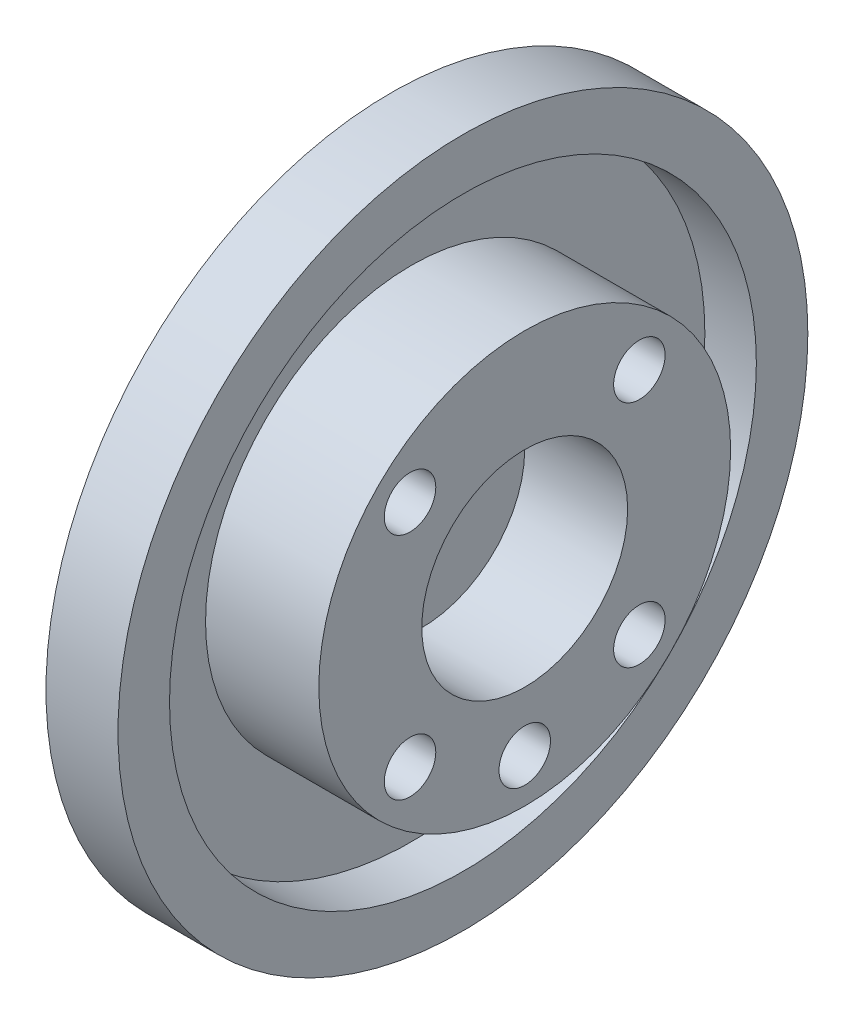
ISO-10303-21;
HEADER;
FILE_DESCRIPTION(('STEP AP214'),'2;1');
FILE_NAME('part.step','',(''),(''),'','','');
FILE_SCHEMA(('AUTOMOTIVE_DESIGN { 1 0 10303 214 1 1 1 1 }'));
ENDSEC;
DATA;
#1=APPLICATION_CONTEXT('core data for automotive mechanical design processes');
#2=APPLICATION_PROTOCOL_DEFINITION('international standard','automotive_design',2000,#1);
#3=PRODUCT_CONTEXT('',#1,'mechanical');
#4=PRODUCT('Part','Part','',(#3));
#5=PRODUCT_RELATED_PRODUCT_CATEGORY('part','',(#4));
#6=PRODUCT_DEFINITION_FORMATION('','',#4);
#7=PRODUCT_DEFINITION_CONTEXT('part definition',#1,'design');
#8=PRODUCT_DEFINITION('design','',#6,#7);
#9=PRODUCT_DEFINITION_SHAPE('','',#8);
#10=(LENGTH_UNIT() NAMED_UNIT(*) SI_UNIT(.MILLI.,.METRE.));
#11=(NAMED_UNIT(*) PLANE_ANGLE_UNIT() SI_UNIT($,.RADIAN.));
#12=(NAMED_UNIT(*) SI_UNIT($,.STERADIAN.) SOLID_ANGLE_UNIT());
#13=UNCERTAINTY_MEASURE_WITH_UNIT(LENGTH_MEASURE(1.E-05),#10,'distance_accuracy_value','');
#14=(GEOMETRIC_REPRESENTATION_CONTEXT(3) GLOBAL_UNCERTAINTY_ASSIGNED_CONTEXT((#13)) GLOBAL_UNIT_ASSIGNED_CONTEXT((#10,
#11,#12)) REPRESENTATION_CONTEXT('',''));
#15=CARTESIAN_POINT('',(0.,0.,0.));
#16=DIRECTION('',(0.,0.,1.));
#17=DIRECTION('',(1.,0.,0.));
#18=AXIS2_PLACEMENT_3D('',#15,#16,#17);
#19=CARTESIAN_POINT('',(2.,0.,0.));
#20=DIRECTION('',(1.,0.,0.));
#21=DIRECTION('',(0.,0.,-1.));
#22=AXIS2_PLACEMENT_3D('',#19,#20,#21);
#23=PLANE('',#22);
#24=CARTESIAN_POINT('',(2.,0.,0.));
#25=DIRECTION('',(1.,0.,0.));
#26=DIRECTION('',(0.,0.,-1.));
#27=AXIS2_PLACEMENT_3D('',#24,#25,#26);
#28=CIRCLE('',#27,28.5);
#29=CARTESIAN_POINT('',(2.,0.,-28.5));
#30=VERTEX_POINT('',#29);
#31=EDGE_CURVE('E140',#30,#30,#28,.T.);
#32=ORIENTED_EDGE('',*,*,#31,.T.);
#33=EDGE_LOOP('',(#32));
#34=FACE_BOUND('',#33,.T.);
#35=CARTESIAN_POINT('',(2.,0.,0.));
#36=DIRECTION('',(1.,0.,0.));
#37=DIRECTION('',(0.,0.,-1.));
#38=AXIS2_PLACEMENT_3D('',#35,#36,#37);
#39=CIRCLE('',#38,20.);
#40=CARTESIAN_POINT('',(2.,0.,-20.));
#41=VERTEX_POINT('',#40);
#42=EDGE_CURVE('E125',#41,#41,#39,.T.);
#43=ORIENTED_EDGE('',*,*,#42,.F.);
#44=EDGE_LOOP('',(#43));
#45=FACE_BOUND('',#44,.T.);
#46=ADVANCED_FACE('F36',(#34,#45),#23,.T.);
#47=CARTESIAN_POINT('',(7.,0.,0.));
#48=DIRECTION('',(-1.,0.,0.));
#49=DIRECTION('',(0.,0.,1.));
#50=AXIS2_PLACEMENT_3D('',#47,#48,#49);
#51=CYLINDRICAL_SURFACE('',#50,33.5);
#52=CARTESIAN_POINT('',(7.,0.,0.));
#53=DIRECTION('',(1.,0.,0.));
#54=DIRECTION('',(0.,0.,-1.));
#55=AXIS2_PLACEMENT_3D('',#52,#53,#54);
#56=CIRCLE('',#55,33.5);
#57=CARTESIAN_POINT('',(7.,0.,-33.5));
#58=VERTEX_POINT('',#57);
#59=EDGE_CURVE('E11',#58,#58,#56,.T.);
#60=ORIENTED_EDGE('',*,*,#59,.F.);
#61=EDGE_LOOP('',(#60));
#62=FACE_BOUND('',#61,.T.);
#63=CARTESIAN_POINT('',(0.,0.,0.));
#64=DIRECTION('',(1.,0.,0.));
#65=DIRECTION('',(0.,0.,-1.));
#66=AXIS2_PLACEMENT_3D('',#63,#64,#65);
#67=CIRCLE('',#66,33.5);
#68=CARTESIAN_POINT('',(0.,0.,-33.5));
#69=VERTEX_POINT('',#68);
#70=EDGE_CURVE('E44',#69,#69,#67,.T.);
#71=ORIENTED_EDGE('',*,*,#70,.T.);
#72=EDGE_LOOP('',(#71));
#73=FACE_BOUND('',#72,.T.);
#74=ADVANCED_FACE('F38',(#62,#73),#51,.T.);
#75=CARTESIAN_POINT('',(7.,0.,0.));
#76=DIRECTION('',(1.,0.,0.));
#77=DIRECTION('',(0.,0.,-1.));
#78=AXIS2_PLACEMENT_3D('',#75,#76,#77);
#79=PLANE('',#78);
#80=CARTESIAN_POINT('',(7.,0.,0.));
#81=DIRECTION('',(1.,0.,0.));
#82=DIRECTION('',(0.,0.,-1.));
#83=AXIS2_PLACEMENT_3D('',#80,#81,#82);
#84=CIRCLE('',#83,28.5);
#85=CARTESIAN_POINT('',(7.,0.,-28.5));
#86=VERTEX_POINT('',#85);
#87=EDGE_CURVE('E137',#86,#86,#84,.T.);
#88=ORIENTED_EDGE('',*,*,#87,.F.);
#89=EDGE_LOOP('',(#88));
#90=FACE_BOUND('',#89,.T.);
#91=ORIENTED_EDGE('',*,*,#59,.T.);
#92=EDGE_LOOP('',(#91));
#93=FACE_BOUND('',#92,.T.);
#94=ADVANCED_FACE('F149',(#90,#93),#79,.T.);
#95=CARTESIAN_POINT('',(0.,0.,0.));
#96=DIRECTION('',(1.,0.,0.));
#97=DIRECTION('',(0.,0.,-1.));
#98=AXIS2_PLACEMENT_3D('',#95,#96,#97);
#99=PLANE('',#98);
#100=CARTESIAN_POINT('',(0.,0.,0.));
#101=DIRECTION('',(1.,0.,0.));
#102=DIRECTION('',(0.,0.,-1.));
#103=AXIS2_PLACEMENT_3D('',#100,#101,#102);
#104=CIRCLE('',#103,2.5);
#105=CARTESIAN_POINT('',(0.,0.,-2.5));
#106=VERTEX_POINT('',#105);
#107=EDGE_CURVE('E134',#106,#106,#104,.T.);
#108=ORIENTED_EDGE('',*,*,#107,.T.);
#109=EDGE_LOOP('',(#108));
#110=FACE_BOUND('',#109,.T.);
#111=ORIENTED_EDGE('',*,*,#70,.F.);
#112=EDGE_LOOP('',(#111));
#113=FACE_BOUND('',#112,.T.);
#114=ADVANCED_FACE('F146',(#110,#113),#99,.F.);
#115=CARTESIAN_POINT('',(2.,0.,0.));
#116=DIRECTION('',(1.,0.,0.));
#117=DIRECTION('',(0.,0.,-1.));
#118=AXIS2_PLACEMENT_3D('',#115,#116,#117);
#119=CYLINDRICAL_SURFACE('',#118,28.5);
#120=ORIENTED_EDGE('',*,*,#31,.F.);
#121=EDGE_LOOP('',(#120));
#122=FACE_BOUND('',#121,.T.);
#123=ORIENTED_EDGE('',*,*,#87,.T.);
#124=EDGE_LOOP('',(#123));
#125=FACE_BOUND('',#124,.T.);
#126=ADVANCED_FACE('F148',(#122,#125),#119,.F.);
#127=CARTESIAN_POINT('',(-3.,0.,0.));
#128=DIRECTION('',(1.,0.,0.));
#129=DIRECTION('',(0.,0.,-1.));
#130=AXIS2_PLACEMENT_3D('',#127,#128,#129);
#131=CYLINDRICAL_SURFACE('',#130,2.5);
#132=CARTESIAN_POINT('',(2.,0.,0.));
#133=DIRECTION('',(1.,0.,0.));
#134=DIRECTION('',(0.,0.,-1.));
#135=AXIS2_PLACEMENT_3D('',#132,#133,#134);
#136=CIRCLE('',#135,2.5);
#137=CARTESIAN_POINT('',(2.,0.,-2.5));
#138=VERTEX_POINT('',#137);
#139=EDGE_CURVE('E131',#138,#138,#136,.F.);
#140=ORIENTED_EDGE('',*,*,#139,.F.);
#141=EDGE_LOOP('',(#140));
#142=FACE_BOUND('',#141,.T.);
#143=ORIENTED_EDGE('',*,*,#107,.F.);
#144=EDGE_LOOP('',(#143));
#145=FACE_BOUND('',#144,.T.);
#146=ADVANCED_FACE('F156',(#142,#145),#131,.F.);
#147=CARTESIAN_POINT('',(2.,0.,0.));
#148=DIRECTION('',(1.,0.,0.));
#149=DIRECTION('',(0.,0.,-1.));
#150=AXIS2_PLACEMENT_3D('',#147,#148,#149);
#151=PLANE('',#150);
#152=ORIENTED_EDGE('',*,*,#139,.T.);
#153=EDGE_LOOP('',(#152));
#154=FACE_BOUND('',#153,.T.);
#155=ADVANCED_FACE('F171',(#154),#151,.F.);
#156=CARTESIAN_POINT('',(13.,0.,0.));
#157=DIRECTION('',(-1.,0.,0.));
#158=DIRECTION('',(0.,0.,1.));
#159=AXIS2_PLACEMENT_3D('',#156,#157,#158);
#160=CYLINDRICAL_SURFACE('',#159,20.);
#161=CARTESIAN_POINT('',(13.,0.,0.));
#162=DIRECTION('',(1.,0.,0.));
#163=DIRECTION('',(0.,0.,-1.));
#164=AXIS2_PLACEMENT_3D('',#161,#162,#163);
#165=CIRCLE('',#164,20.);
#166=CARTESIAN_POINT('',(13.,0.,-20.));
#167=VERTEX_POINT('',#166);
#168=EDGE_CURVE('E128',#167,#167,#165,.T.);
#169=ORIENTED_EDGE('',*,*,#168,.F.);
#170=EDGE_LOOP('',(#169));
#171=FACE_BOUND('',#170,.T.);
#172=ORIENTED_EDGE('',*,*,#42,.T.);
#173=EDGE_LOOP('',(#172));
#174=FACE_BOUND('',#173,.T.);
#175=ADVANCED_FACE('F173',(#171,#174),#160,.T.);
#176=CARTESIAN_POINT('',(13.,0.,0.));
#177=DIRECTION('',(1.,0.,0.));
#178=DIRECTION('',(0.,0.,-1.));
#179=AXIS2_PLACEMENT_3D('',#176,#177,#178);
#180=PLANE('',#179);
#181=CARTESIAN_POINT('',(13.,-15.7403974326229,0.));
#182=DIRECTION('',(1.,0.,0.));
#183=DIRECTION('',(0.,0.,-1.));
#184=AXIS2_PLACEMENT_3D('',#181,#182,#183);
#185=CIRCLE('',#184,2.5);
#186=CARTESIAN_POINT('',(13.,-15.7403974326229,-2.5));
#187=VERTEX_POINT('',#186);
#188=EDGE_CURVE('E74',#187,#187,#185,.T.);
#189=ORIENTED_EDGE('',*,*,#188,.F.);
#190=EDGE_LOOP('',(#189));
#191=FACE_BOUND('',#190,.T.);
#192=CARTESIAN_POINT('',(13.,11.1369318036882,11.1369318036881));
#193=DIRECTION('',(1.,0.,0.));
#194=DIRECTION('',(0.,0.,-1.));
#195=AXIS2_PLACEMENT_3D('',#192,#193,#194);
#196=CIRCLE('',#195,2.5);
#197=CARTESIAN_POINT('',(13.,11.1369318036882,8.63693180368807));
#198=VERTEX_POINT('',#197);
#199=EDGE_CURVE('E80',#198,#198,#196,.T.);
#200=ORIENTED_EDGE('',*,*,#199,.F.);
#201=EDGE_LOOP('',(#200));
#202=FACE_BOUND('',#201,.T.);
#203=CARTESIAN_POINT('',(13.,-11.1369318036882,-11.1369318036881));
#204=DIRECTION('',(1.,0.,0.));
#205=DIRECTION('',(0.,0.,-1.));
#206=AXIS2_PLACEMENT_3D('',#203,#204,#205);
#207=CIRCLE('',#206,2.5);
#208=CARTESIAN_POINT('',(13.,-11.1369318036882,-13.6369318036881));
#209=VERTEX_POINT('',#208);
#210=EDGE_CURVE('E92',#209,#209,#207,.T.);
#211=ORIENTED_EDGE('',*,*,#210,.F.);
#212=EDGE_LOOP('',(#211));
#213=FACE_BOUND('',#212,.T.);
#214=CARTESIAN_POINT('',(13.,-11.1369318036881,11.1369318036882));
#215=DIRECTION('',(1.,0.,0.));
#216=DIRECTION('',(0.,0.,-1.));
#217=AXIS2_PLACEMENT_3D('',#214,#215,#216);
#218=CIRCLE('',#217,2.5);
#219=CARTESIAN_POINT('',(13.,-11.1369318036881,8.63693180368818));
#220=VERTEX_POINT('',#219);
#221=EDGE_CURVE('E104',#220,#220,#218,.T.);
#222=ORIENTED_EDGE('',*,*,#221,.F.);
#223=EDGE_LOOP('',(#222));
#224=FACE_BOUND('',#223,.T.);
#225=CARTESIAN_POINT('',(13.,11.1369318036881,-11.1369318036882));
#226=DIRECTION('',(1.,0.,0.));
#227=DIRECTION('',(0.,0.,-1.));
#228=AXIS2_PLACEMENT_3D('',#225,#226,#227);
#229=CIRCLE('',#228,2.5);
#230=CARTESIAN_POINT('',(13.,11.1369318036881,-13.6369318036882));
#231=VERTEX_POINT('',#230);
#232=EDGE_CURVE('E116',#231,#231,#229,.T.);
#233=ORIENTED_EDGE('',*,*,#232,.F.);
#234=EDGE_LOOP('',(#233));
#235=FACE_BOUND('',#234,.T.);
#236=CARTESIAN_POINT('',(13.,0.,0.));
#237=DIRECTION('',(1.,0.,0.));
#238=DIRECTION('',(0.,0.,-1.));
#239=AXIS2_PLACEMENT_3D('',#236,#237,#238);
#240=CIRCLE('',#239,10.);
#241=CARTESIAN_POINT('',(13.,0.,-10.));
#242=VERTEX_POINT('',#241);
#243=EDGE_CURVE('E119',#242,#242,#240,.T.);
#244=ORIENTED_EDGE('',*,*,#243,.F.);
#245=EDGE_LOOP('',(#244));
#246=FACE_BOUND('',#245,.T.);
#247=ORIENTED_EDGE('',*,*,#168,.T.);
#248=EDGE_LOOP('',(#247));
#249=FACE_BOUND('',#248,.T.);
#250=ADVANCED_FACE('F176',(#191,#202,#213,#224,#235,#246,#249),#180,.T.);
#251=CARTESIAN_POINT('',(3.,0.,0.));
#252=DIRECTION('',(1.,0.,0.));
#253=DIRECTION('',(0.,0.,-1.));
#254=AXIS2_PLACEMENT_3D('',#251,#252,#253);
#255=CYLINDRICAL_SURFACE('',#254,10.);
#256=CARTESIAN_POINT('',(3.,0.,0.));
#257=DIRECTION('',(1.,0.,0.));
#258=DIRECTION('',(0.,0.,-1.));
#259=AXIS2_PLACEMENT_3D('',#256,#257,#258);
#260=CIRCLE('',#259,10.);
#261=CARTESIAN_POINT('',(3.,0.,-10.));
#262=VERTEX_POINT('',#261);
#263=EDGE_CURVE('E122',#262,#262,#260,.T.);
#264=ORIENTED_EDGE('',*,*,#263,.F.);
#265=EDGE_LOOP('',(#264));
#266=FACE_BOUND('',#265,.T.);
#267=ORIENTED_EDGE('',*,*,#243,.T.);
#268=EDGE_LOOP('',(#267));
#269=FACE_BOUND('',#268,.T.);
#270=ADVANCED_FACE('F180',(#266,#269),#255,.F.);
#271=CARTESIAN_POINT('',(3.,0.,0.));
#272=DIRECTION('',(1.,0.,0.));
#273=DIRECTION('',(0.,0.,-1.));
#274=AXIS2_PLACEMENT_3D('',#271,#272,#273);
#275=PLANE('',#274);
#276=ORIENTED_EDGE('',*,*,#263,.T.);
#277=EDGE_LOOP('',(#276));
#278=FACE_BOUND('',#277,.T.);
#279=ADVANCED_FACE('F187',(#278),#275,.T.);
#280=CARTESIAN_POINT('',(13.,11.1369318036881,-11.1369318036882));
#281=DIRECTION('',(1.,0.,0.));
#282=DIRECTION('',(0.,0.,-1.));
#283=AXIS2_PLACEMENT_3D('',#280,#281,#282);
#284=CYLINDRICAL_SURFACE('',#283,2.5);
#285=CARTESIAN_POINT('',(3.,11.1369318036881,-11.1369318036882));
#286=DIRECTION('',(1.,0.,0.));
#287=DIRECTION('',(0.,0.,-1.));
#288=AXIS2_PLACEMENT_3D('',#285,#286,#287);
#289=CIRCLE('',#288,2.5);
#290=CARTESIAN_POINT('',(3.,11.1369318036881,-13.6369318036882));
#291=VERTEX_POINT('',#290);
#292=EDGE_CURVE('E113',#291,#291,#289,.T.);
#293=ORIENTED_EDGE('',*,*,#292,.F.);
#294=EDGE_LOOP('',(#293));
#295=FACE_BOUND('',#294,.T.);
#296=ORIENTED_EDGE('',*,*,#232,.T.);
#297=EDGE_LOOP('',(#296));
#298=FACE_BOUND('',#297,.T.);
#299=ADVANCED_FACE('F191',(#295,#298),#284,.F.);
#300=CARTESIAN_POINT('',(3.,13.2369318036881,-11.1369318036882));
#301=DIRECTION('',(-1.,0.,0.));
#302=DIRECTION('',(0.,0.,1.));
#303=AXIS2_PLACEMENT_3D('',#300,#301,#302);
#304=PLANE('',#303);
#305=CARTESIAN_POINT('',(3.,11.1369318036881,-11.1369318036882));
#306=DIRECTION('',(1.,0.,0.));
#307=DIRECTION('',(0.,0.,-1.));
#308=AXIS2_PLACEMENT_3D('',#305,#306,#307);
#309=CIRCLE('',#308,2.1);
#310=CARTESIAN_POINT('',(3.,11.1369318036881,-13.2369318036882));
#311=VERTEX_POINT('',#310);
#312=EDGE_CURVE('E110',#311,#311,#309,.T.);
#313=ORIENTED_EDGE('',*,*,#312,.F.);
#314=EDGE_LOOP('',(#313));
#315=FACE_BOUND('',#314,.T.);
#316=ORIENTED_EDGE('',*,*,#292,.T.);
#317=EDGE_LOOP('',(#316));
#318=FACE_BOUND('',#317,.T.);
#319=ADVANCED_FACE('F195',(#315,#318),#304,.F.);
#320=CARTESIAN_POINT('',(13.,11.1369318036881,-11.1369318036882));
#321=DIRECTION('',(1.,0.,0.));
#322=DIRECTION('',(0.,0.,-1.));
#323=AXIS2_PLACEMENT_3D('',#320,#321,#322);
#324=CYLINDRICAL_SURFACE('',#323,2.1);
#325=CARTESIAN_POINT('',(4.,11.1369318036881,-11.1369318036882));
#326=DIRECTION('',(1.,0.,0.));
#327=DIRECTION('',(0.,0.,-1.));
#328=AXIS2_PLACEMENT_3D('',#325,#326,#327);
#329=CIRCLE('',#328,2.1);
#330=CARTESIAN_POINT('',(4.,11.1369318036881,-13.2369318036882));
#331=VERTEX_POINT('',#330);
#332=EDGE_CURVE('E107',#331,#331,#329,.T.);
#333=ORIENTED_EDGE('',*,*,#332,.F.);
#334=EDGE_LOOP('',(#333));
#335=FACE_BOUND('',#334,.T.);
#336=ORIENTED_EDGE('',*,*,#312,.T.);
#337=EDGE_LOOP('',(#336));
#338=FACE_BOUND('',#337,.T.);
#339=ADVANCED_FACE('F199',(#335,#338),#324,.T.);
#340=CARTESIAN_POINT('',(4.,11.1369318036881,-11.1369318036882));
#341=DIRECTION('',(1.,0.,0.));
#342=DIRECTION('',(0.,0.,-1.));
#343=AXIS2_PLACEMENT_3D('',#340,#341,#342);
#344=CONICAL_SURFACE('',#343,2.1,1.02974425867665);
#345=CARTESIAN_POINT('',(2.73819270004212,11.1369318036881,-11.1369318036882));
#346=VERTEX_POINT('',#345);
#347=VERTEX_LOOP('',#346);
#348=FACE_BOUND('',#347,.T.);
#349=ORIENTED_EDGE('',*,*,#332,.T.);
#350=EDGE_LOOP('',(#349));
#351=FACE_BOUND('',#350,.T.);
#352=ADVANCED_FACE('F203',(#348,#351),#344,.F.);
#353=CARTESIAN_POINT('',(13.,-11.1369318036881,11.1369318036882));
#354=DIRECTION('',(1.,0.,0.));
#355=DIRECTION('',(0.,0.,-1.));
#356=AXIS2_PLACEMENT_3D('',#353,#354,#355);
#357=CYLINDRICAL_SURFACE('',#356,2.5);
#358=CARTESIAN_POINT('',(3.,-11.1369318036881,11.1369318036882));
#359=DIRECTION('',(1.,0.,0.));
#360=DIRECTION('',(0.,0.,-1.));
#361=AXIS2_PLACEMENT_3D('',#358,#359,#360);
#362=CIRCLE('',#361,2.5);
#363=CARTESIAN_POINT('',(3.,-11.1369318036881,8.63693180368818));
#364=VERTEX_POINT('',#363);
#365=EDGE_CURVE('E101',#364,#364,#362,.T.);
#366=ORIENTED_EDGE('',*,*,#365,.F.);
#367=EDGE_LOOP('',(#366));
#368=FACE_BOUND('',#367,.T.);
#369=ORIENTED_EDGE('',*,*,#221,.T.);
#370=EDGE_LOOP('',(#369));
#371=FACE_BOUND('',#370,.T.);
#372=ADVANCED_FACE('F207',(#368,#371),#357,.F.);
#373=CARTESIAN_POINT('',(3.,-9.03693180368807,11.1369318036882));
#374=DIRECTION('',(-1.,0.,0.));
#375=DIRECTION('',(0.,0.,1.));
#376=AXIS2_PLACEMENT_3D('',#373,#374,#375);
#377=PLANE('',#376);
#378=CARTESIAN_POINT('',(3.,-11.1369318036881,11.1369318036882));
#379=DIRECTION('',(1.,0.,0.));
#380=DIRECTION('',(0.,0.,-1.));
#381=AXIS2_PLACEMENT_3D('',#378,#379,#380);
#382=CIRCLE('',#381,2.1);
#383=CARTESIAN_POINT('',(3.,-11.1369318036881,9.03693180368818));
#384=VERTEX_POINT('',#383);
#385=EDGE_CURVE('E98',#384,#384,#382,.T.);
#386=ORIENTED_EDGE('',*,*,#385,.F.);
#387=EDGE_LOOP('',(#386));
#388=FACE_BOUND('',#387,.T.);
#389=ORIENTED_EDGE('',*,*,#365,.T.);
#390=EDGE_LOOP('',(#389));
#391=FACE_BOUND('',#390,.T.);
#392=ADVANCED_FACE('F210',(#388,#391),#377,.F.);
#393=CARTESIAN_POINT('',(13.,-11.1369318036881,11.1369318036882));
#394=DIRECTION('',(1.,0.,0.));
#395=DIRECTION('',(0.,0.,-1.));
#396=AXIS2_PLACEMENT_3D('',#393,#394,#395);
#397=CYLINDRICAL_SURFACE('',#396,2.1);
#398=CARTESIAN_POINT('',(4.,-11.1369318036881,11.1369318036882));
#399=DIRECTION('',(1.,0.,0.));
#400=DIRECTION('',(0.,0.,-1.));
#401=AXIS2_PLACEMENT_3D('',#398,#399,#400);
#402=CIRCLE('',#401,2.1);
#403=CARTESIAN_POINT('',(4.,-11.1369318036881,9.03693180368818));
#404=VERTEX_POINT('',#403);
#405=EDGE_CURVE('E95',#404,#404,#402,.T.);
#406=ORIENTED_EDGE('',*,*,#405,.F.);
#407=EDGE_LOOP('',(#406));
#408=FACE_BOUND('',#407,.T.);
#409=ORIENTED_EDGE('',*,*,#385,.T.);
#410=EDGE_LOOP('',(#409));
#411=FACE_BOUND('',#410,.T.);
#412=ADVANCED_FACE('F214',(#408,#411),#397,.T.);
#413=CARTESIAN_POINT('',(4.,-11.1369318036881,11.1369318036882));
#414=DIRECTION('',(1.,0.,0.));
#415=DIRECTION('',(0.,0.,-1.));
#416=AXIS2_PLACEMENT_3D('',#413,#414,#415);
#417=CONICAL_SURFACE('',#416,2.1,1.02974425867665);
#418=CARTESIAN_POINT('',(2.73819270004212,-11.1369318036881,11.1369318036882));
#419=VERTEX_POINT('',#418);
#420=VERTEX_LOOP('',#419);
#421=FACE_BOUND('',#420,.T.);
#422=ORIENTED_EDGE('',*,*,#405,.T.);
#423=EDGE_LOOP('',(#422));
#424=FACE_BOUND('',#423,.T.);
#425=ADVANCED_FACE('F218',(#421,#424),#417,.F.);
#426=CARTESIAN_POINT('',(13.,-11.1369318036882,-11.1369318036881));
#427=DIRECTION('',(1.,0.,0.));
#428=DIRECTION('',(0.,0.,-1.));
#429=AXIS2_PLACEMENT_3D('',#426,#427,#428);
#430=CYLINDRICAL_SURFACE('',#429,2.5);
#431=CARTESIAN_POINT('',(3.,-11.1369318036882,-11.1369318036881));
#432=DIRECTION('',(1.,0.,0.));
#433=DIRECTION('',(0.,0.,-1.));
#434=AXIS2_PLACEMENT_3D('',#431,#432,#433);
#435=CIRCLE('',#434,2.5);
#436=CARTESIAN_POINT('',(3.,-11.1369318036882,-13.6369318036881));
#437=VERTEX_POINT('',#436);
#438=EDGE_CURVE('E89',#437,#437,#435,.T.);
#439=ORIENTED_EDGE('',*,*,#438,.F.);
#440=EDGE_LOOP('',(#439));
#441=FACE_BOUND('',#440,.T.);
#442=ORIENTED_EDGE('',*,*,#210,.T.);
#443=EDGE_LOOP('',(#442));
#444=FACE_BOUND('',#443,.T.);
#445=ADVANCED_FACE('F222',(#441,#444),#430,.F.);
#446=CARTESIAN_POINT('',(3.,-9.03693180368818,-11.1369318036881));
#447=DIRECTION('',(-1.,0.,0.));
#448=DIRECTION('',(0.,0.,1.));
#449=AXIS2_PLACEMENT_3D('',#446,#447,#448);
#450=PLANE('',#449);
#451=CARTESIAN_POINT('',(3.,-11.1369318036882,-11.1369318036881));
#452=DIRECTION('',(1.,0.,0.));
#453=DIRECTION('',(0.,0.,-1.));
#454=AXIS2_PLACEMENT_3D('',#451,#452,#453);
#455=CIRCLE('',#454,2.1);
#456=CARTESIAN_POINT('',(3.,-11.1369318036882,-13.2369318036881));
#457=VERTEX_POINT('',#456);
#458=EDGE_CURVE('E86',#457,#457,#455,.T.);
#459=ORIENTED_EDGE('',*,*,#458,.F.);
#460=EDGE_LOOP('',(#459));
#461=FACE_BOUND('',#460,.T.);
#462=ORIENTED_EDGE('',*,*,#438,.T.);
#463=EDGE_LOOP('',(#462));
#464=FACE_BOUND('',#463,.T.);
#465=ADVANCED_FACE('F225',(#461,#464),#450,.F.);
#466=CARTESIAN_POINT('',(13.,-11.1369318036882,-11.1369318036881));
#467=DIRECTION('',(1.,0.,0.));
#468=DIRECTION('',(0.,0.,-1.));
#469=AXIS2_PLACEMENT_3D('',#466,#467,#468);
#470=CYLINDRICAL_SURFACE('',#469,2.1);
#471=CARTESIAN_POINT('',(4.,-11.1369318036882,-11.1369318036881));
#472=DIRECTION('',(1.,0.,0.));
#473=DIRECTION('',(0.,0.,-1.));
#474=AXIS2_PLACEMENT_3D('',#471,#472,#473);
#475=CIRCLE('',#474,2.1);
#476=CARTESIAN_POINT('',(4.,-11.1369318036882,-13.2369318036881));
#477=VERTEX_POINT('',#476);
#478=EDGE_CURVE('E83',#477,#477,#475,.T.);
#479=ORIENTED_EDGE('',*,*,#478,.F.);
#480=EDGE_LOOP('',(#479));
#481=FACE_BOUND('',#480,.T.);
#482=ORIENTED_EDGE('',*,*,#458,.T.);
#483=EDGE_LOOP('',(#482));
#484=FACE_BOUND('',#483,.T.);
#485=ADVANCED_FACE('F229',(#481,#484),#470,.T.);
#486=CARTESIAN_POINT('',(4.,-11.1369318036882,-11.1369318036881));
#487=DIRECTION('',(1.,0.,0.));
#488=DIRECTION('',(0.,0.,-1.));
#489=AXIS2_PLACEMENT_3D('',#486,#487,#488);
#490=CONICAL_SURFACE('',#489,2.1,1.02974425867665);
#491=CARTESIAN_POINT('',(2.73819270004212,-11.1369318036882,-11.1369318036881));
#492=VERTEX_POINT('',#491);
#493=VERTEX_LOOP('',#492);
#494=FACE_BOUND('',#493,.T.);
#495=ORIENTED_EDGE('',*,*,#478,.T.);
#496=EDGE_LOOP('',(#495));
#497=FACE_BOUND('',#496,.T.);
#498=ADVANCED_FACE('F233',(#494,#497),#490,.F.);
#499=CARTESIAN_POINT('',(13.,11.1369318036882,11.1369318036881));
#500=DIRECTION('',(1.,0.,0.));
#501=DIRECTION('',(0.,0.,-1.));
#502=AXIS2_PLACEMENT_3D('',#499,#500,#501);
#503=CYLINDRICAL_SURFACE('',#502,2.5);
#504=CARTESIAN_POINT('',(3.,11.1369318036882,11.1369318036881));
#505=DIRECTION('',(1.,0.,0.));
#506=DIRECTION('',(0.,0.,-1.));
#507=AXIS2_PLACEMENT_3D('',#504,#505,#506);
#508=CIRCLE('',#507,2.5);
#509=CARTESIAN_POINT('',(3.,11.1369318036882,8.63693180368807));
#510=VERTEX_POINT('',#509);
#511=EDGE_CURVE('E71',#510,#510,#508,.T.);
#512=ORIENTED_EDGE('',*,*,#511,.F.);
#513=EDGE_LOOP('',(#512));
#514=FACE_BOUND('',#513,.T.);
#515=ORIENTED_EDGE('',*,*,#199,.T.);
#516=EDGE_LOOP('',(#515));
#517=FACE_BOUND('',#516,.T.);
#518=ADVANCED_FACE('F237',(#514,#517),#503,.F.);
#519=CARTESIAN_POINT('',(3.,13.2369318036882,11.1369318036881));
#520=DIRECTION('',(-1.,0.,0.));
#521=DIRECTION('',(0.,0.,1.));
#522=AXIS2_PLACEMENT_3D('',#519,#520,#521);
#523=PLANE('',#522);
#524=CARTESIAN_POINT('',(3.,11.1369318036882,11.1369318036881));
#525=DIRECTION('',(1.,0.,0.));
#526=DIRECTION('',(0.,0.,-1.));
#527=AXIS2_PLACEMENT_3D('',#524,#525,#526);
#528=CIRCLE('',#527,2.1);
#529=CARTESIAN_POINT('',(3.,11.1369318036882,9.03693180368807));
#530=VERTEX_POINT('',#529);
#531=EDGE_CURVE('E67',#530,#530,#528,.T.);
#532=ORIENTED_EDGE('',*,*,#531,.F.);
#533=EDGE_LOOP('',(#532));
#534=FACE_BOUND('',#533,.T.);
#535=ORIENTED_EDGE('',*,*,#511,.T.);
#536=EDGE_LOOP('',(#535));
#537=FACE_BOUND('',#536,.T.);
#538=ADVANCED_FACE('F241',(#534,#537),#523,.F.);
#539=CARTESIAN_POINT('',(13.,11.1369318036882,11.1369318036881));
#540=DIRECTION('',(1.,0.,0.));
#541=DIRECTION('',(0.,0.,-1.));
#542=AXIS2_PLACEMENT_3D('',#539,#540,#541);
#543=CYLINDRICAL_SURFACE('',#542,2.1);
#544=CARTESIAN_POINT('',(4.,11.1369318036882,11.1369318036881));
#545=DIRECTION('',(1.,0.,0.));
#546=DIRECTION('',(0.,0.,-1.));
#547=AXIS2_PLACEMENT_3D('',#544,#545,#546);
#548=CIRCLE('',#547,2.1);
#549=CARTESIAN_POINT('',(4.,11.1369318036882,9.03693180368807));
#550=VERTEX_POINT('',#549);
#551=EDGE_CURVE('E65',#550,#550,#548,.T.);
#552=ORIENTED_EDGE('',*,*,#551,.F.);
#553=EDGE_LOOP('',(#552));
#554=FACE_BOUND('',#553,.T.);
#555=ORIENTED_EDGE('',*,*,#531,.T.);
#556=EDGE_LOOP('',(#555));
#557=FACE_BOUND('',#556,.T.);
#558=ADVANCED_FACE('F61',(#554,#557),#543,.T.);
#559=CARTESIAN_POINT('',(4.,11.1369318036882,11.1369318036881));
#560=DIRECTION('',(1.,0.,0.));
#561=DIRECTION('',(0.,0.,-1.));
#562=AXIS2_PLACEMENT_3D('',#559,#560,#561);
#563=CONICAL_SURFACE('',#562,2.1,1.02974425867665);
#564=CARTESIAN_POINT('',(2.73819270004212,11.1369318036882,11.1369318036881));
#565=VERTEX_POINT('',#564);
#566=VERTEX_LOOP('',#565);
#567=FACE_BOUND('',#566,.T.);
#568=ORIENTED_EDGE('',*,*,#551,.T.);
#569=EDGE_LOOP('',(#568));
#570=FACE_BOUND('',#569,.T.);
#571=ADVANCED_FACE('F57',(#567,#570),#563,.F.);
#572=CARTESIAN_POINT('',(6.,-15.7403974326229,0.));
#573=DIRECTION('',(1.,0.,0.));
#574=DIRECTION('',(0.,0.,-1.));
#575=AXIS2_PLACEMENT_3D('',#572,#573,#574);
#576=CYLINDRICAL_SURFACE('',#575,2.5);
#577=CARTESIAN_POINT('',(6.,-15.7403974326229,0.));
#578=DIRECTION('',(1.,0.,0.));
#579=DIRECTION('',(0.,0.,-1.));
#580=AXIS2_PLACEMENT_3D('',#577,#578,#579);
#581=CIRCLE('',#580,2.5);
#582=CARTESIAN_POINT('',(6.,-15.7403974326229,-2.5));
#583=VERTEX_POINT('',#582);
#584=EDGE_CURVE('E68',#583,#583,#581,.T.);
#585=ORIENTED_EDGE('',*,*,#584,.F.);
#586=EDGE_LOOP('',(#585));
#587=FACE_BOUND('',#586,.T.);
#588=ORIENTED_EDGE('',*,*,#188,.T.);
#589=EDGE_LOOP('',(#588));
#590=FACE_BOUND('',#589,.T.);
#591=ADVANCED_FACE('F60',(#587,#590),#576,.F.);
#592=CARTESIAN_POINT('',(6.,-15.7403974326229,0.));
#593=DIRECTION('',(1.,0.,0.));
#594=DIRECTION('',(0.,0.,-1.));
#595=AXIS2_PLACEMENT_3D('',#592,#593,#594);
#596=PLANE('',#595);
#597=ORIENTED_EDGE('',*,*,#584,.T.);
#598=EDGE_LOOP('',(#597));
#599=FACE_BOUND('',#598,.T.);
#600=ADVANCED_FACE('F250',(#599),#596,.T.);
#601=CLOSED_SHELL('',(#46,#74,#94,#114,#126,#146,#155,#175,#250,#270,#279,#299,#319,#339,#352,
#372,#392,#412,#425,#445,#465,#485,#498,#518,#538,#558,#571,#591,#600));
#602=MANIFOLD_SOLID_BREP('B2',#601);
#603=ADVANCED_BREP_SHAPE_REPRESENTATION('',(#18,#602),#14);
#604=SHAPE_DEFINITION_REPRESENTATION(#9,#603);
ENDSEC;
END-ISO-10303-21;
